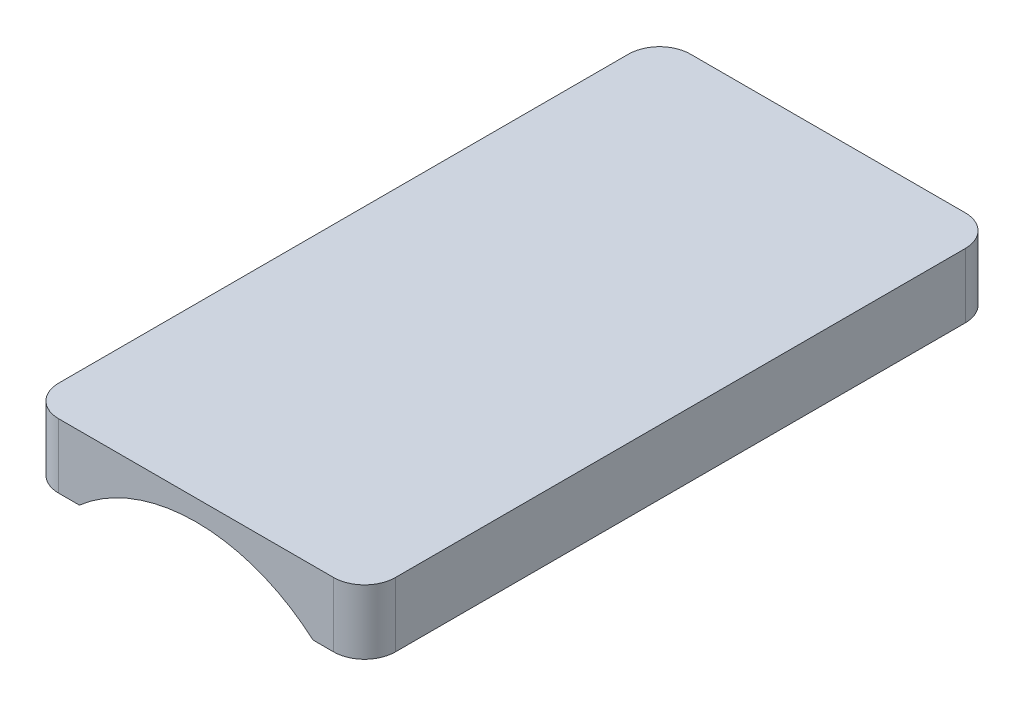
ISO-10303-21;
HEADER;
FILE_DESCRIPTION(('STEP AP214'),'2;1');
FILE_NAME('part.step','',(''),(''),'','','');
FILE_SCHEMA(('AUTOMOTIVE_DESIGN { 1 0 10303 214 1 1 1 1 }'));
ENDSEC;
DATA;
#1=APPLICATION_CONTEXT('core data for automotive mechanical design processes');
#2=APPLICATION_PROTOCOL_DEFINITION('international standard','automotive_design',2000,#1);
#3=PRODUCT_CONTEXT('',#1,'mechanical');
#4=PRODUCT('Part','Part','',(#3));
#5=PRODUCT_RELATED_PRODUCT_CATEGORY('part','',(#4));
#6=PRODUCT_DEFINITION_FORMATION('','',#4);
#7=PRODUCT_DEFINITION_CONTEXT('part definition',#1,'design');
#8=PRODUCT_DEFINITION('design','',#6,#7);
#9=PRODUCT_DEFINITION_SHAPE('','',#8);
#10=(LENGTH_UNIT() NAMED_UNIT(*) SI_UNIT(.MILLI.,.METRE.));
#11=(NAMED_UNIT(*) PLANE_ANGLE_UNIT() SI_UNIT($,.RADIAN.));
#12=(NAMED_UNIT(*) SI_UNIT($,.STERADIAN.) SOLID_ANGLE_UNIT());
#13=UNCERTAINTY_MEASURE_WITH_UNIT(LENGTH_MEASURE(1.E-05),#10,'distance_accuracy_value','');
#14=(GEOMETRIC_REPRESENTATION_CONTEXT(3) GLOBAL_UNCERTAINTY_ASSIGNED_CONTEXT((#13)) GLOBAL_UNIT_ASSIGNED_CONTEXT((#10,
#11,#12)) REPRESENTATION_CONTEXT('',''));
#15=CARTESIAN_POINT('',(0.,0.,0.));
#16=DIRECTION('',(0.,0.,1.));
#17=DIRECTION('',(1.,0.,0.));
#18=AXIS2_PLACEMENT_3D('',#15,#16,#17);
#19=CARTESIAN_POINT('',(32.65,0.,-61.25));
#20=DIRECTION('',(0.,1.,0.));
#21=DIRECTION('',(0.,0.,1.));
#22=AXIS2_PLACEMENT_3D('',#19,#20,#21);
#23=PLANE('',#22);
#24=DIRECTION('',(-1.,0.,0.));
#25=VECTOR('',#24,1.);
#26=CARTESIAN_POINT('',(32.65,0.,0.));
#27=LINE('',#26,#25);
#28=CARTESIAN_POINT('',(5.,0.,0.));
#29=VERTEX_POINT('',#28);
#30=CARTESIAN_POINT('',(3.,0.,0.));
#31=VERTEX_POINT('',#30);
#32=EDGE_CURVE('E211',#29,#31,#27,.T.);
#33=ORIENTED_EDGE('',*,*,#32,.T.);
#34=CARTESIAN_POINT('',(3.,0.,-3.));
#35=DIRECTION('',(0.,1.,0.));
#36=DIRECTION('',(0.,0.,1.));
#37=AXIS2_PLACEMENT_3D('',#34,#35,#36);
#38=CIRCLE('',#37,3.);
#39=CARTESIAN_POINT('',(0.,0.,-3.));
#40=VERTEX_POINT('',#39);
#41=EDGE_CURVE('E241',#31,#40,#38,.F.);
#42=ORIENTED_EDGE('',*,*,#41,.T.);
#43=DIRECTION('',(0.,0.,-1.));
#44=VECTOR('',#43,1.);
#45=CARTESIAN_POINT('',(0.,0.,-61.25));
#46=LINE('',#45,#44);
#47=CARTESIAN_POINT('',(0.,0.,-58.25));
#48=VERTEX_POINT('',#47);
#49=EDGE_CURVE('E203',#40,#48,#46,.T.);
#50=ORIENTED_EDGE('',*,*,#49,.T.);
#51=CARTESIAN_POINT('',(3.,0.,-58.25));
#52=DIRECTION('',(0.,1.,0.));
#53=DIRECTION('',(0.,0.,1.));
#54=AXIS2_PLACEMENT_3D('',#51,#52,#53);
#55=CIRCLE('',#54,3.);
#56=CARTESIAN_POINT('',(3.,0.,-61.25));
#57=VERTEX_POINT('',#56);
#58=EDGE_CURVE('E235',#48,#57,#55,.F.);
#59=ORIENTED_EDGE('',*,*,#58,.T.);
#60=DIRECTION('',(-1.,0.,0.));
#61=VECTOR('',#60,1.);
#62=CARTESIAN_POINT('',(32.65,0.,-61.25));
#63=LINE('',#62,#61);
#64=CARTESIAN_POINT('',(29.65,0.,-61.25));
#65=VERTEX_POINT('',#64);
#66=EDGE_CURVE('E224',#65,#57,#63,.T.);
#67=ORIENTED_EDGE('',*,*,#66,.F.);
#68=CARTESIAN_POINT('',(29.65,0.,-58.25));
#69=DIRECTION('',(0.,1.,0.));
#70=DIRECTION('',(0.,0.,1.));
#71=AXIS2_PLACEMENT_3D('',#68,#69,#70);
#72=CIRCLE('',#71,3.);
#73=CARTESIAN_POINT('',(32.65,0.,-58.25));
#74=VERTEX_POINT('',#73);
#75=EDGE_CURVE('E237',#65,#74,#72,.F.);
#76=ORIENTED_EDGE('',*,*,#75,.T.);
#77=DIRECTION('',(0.,0.,-1.));
#78=VECTOR('',#77,1.);
#79=CARTESIAN_POINT('',(32.65,0.,-61.25));
#80=LINE('',#79,#78);
#81=CARTESIAN_POINT('',(32.65,0.,-3.));
#82=VERTEX_POINT('',#81);
#83=EDGE_CURVE('E204',#82,#74,#80,.T.);
#84=ORIENTED_EDGE('',*,*,#83,.F.);
#85=CARTESIAN_POINT('',(29.65,0.,-3.));
#86=DIRECTION('',(0.,1.,0.));
#87=DIRECTION('',(0.,0.,1.));
#88=AXIS2_PLACEMENT_3D('',#85,#86,#87);
#89=CIRCLE('',#88,3.);
#90=CARTESIAN_POINT('',(29.65,0.,0.));
#91=VERTEX_POINT('',#90);
#92=EDGE_CURVE('E239',#82,#91,#89,.F.);
#93=ORIENTED_EDGE('',*,*,#92,.T.);
#94=CARTESIAN_POINT('',(27.65,0.,0.));
#95=VERTEX_POINT('',#94);
#96=EDGE_CURVE('E218',#91,#95,#27,.T.);
#97=ORIENTED_EDGE('',*,*,#96,.T.);
#98=DIRECTION('',(0.,0.,1.));
#99=VECTOR('',#98,1.);
#100=CARTESIAN_POINT('',(27.65,0.,-35.));
#101=LINE('',#100,#99);
#102=CARTESIAN_POINT('',(27.65,0.,-35.));
#103=VERTEX_POINT('',#102);
#104=EDGE_CURVE('E200',#103,#95,#101,.T.);
#105=ORIENTED_EDGE('',*,*,#104,.F.);
#106=DIRECTION('',(1.,0.,0.));
#107=VECTOR('',#106,1.);
#108=CARTESIAN_POINT('',(5.,0.,-35.));
#109=LINE('',#108,#107);
#110=CARTESIAN_POINT('',(5.,0.,-35.));
#111=VERTEX_POINT('',#110);
#112=EDGE_CURVE('E194',#111,#103,#109,.T.);
#113=ORIENTED_EDGE('',*,*,#112,.F.);
#114=DIRECTION('',(0.,0.,1.));
#115=VECTOR('',#114,1.);
#116=CARTESIAN_POINT('',(5.,0.,-35.));
#117=LINE('',#116,#115);
#118=EDGE_CURVE('E197',#111,#29,#117,.T.);
#119=ORIENTED_EDGE('',*,*,#118,.T.);
#120=EDGE_LOOP('',(#33,#42,#50,#59,#67,#76,#84,#93,#97,#105,#113,#119));
#121=FACE_BOUND('',#120,.T.);
#122=ADVANCED_FACE('F33',(#121),#23,.F.);
#123=CARTESIAN_POINT('',(32.65,6.25,-61.25));
#124=DIRECTION('',(0.,0.,1.));
#125=DIRECTION('',(1.,0.,0.));
#126=AXIS2_PLACEMENT_3D('',#123,#124,#125);
#127=PLANE('',#126);
#128=DIRECTION('',(0.,1.,0.));
#129=VECTOR('',#128,1.);
#130=CARTESIAN_POINT('',(11.175,1.,-61.25));
#131=LINE('',#130,#129);
#132=CARTESIAN_POINT('',(11.175,1.,-61.25));
#133=VERTEX_POINT('',#132);
#134=CARTESIAN_POINT('',(11.175,5.25000000000001,-61.25));
#135=VERTEX_POINT('',#134);
#136=EDGE_CURVE('E177',#133,#135,#131,.T.);
#137=ORIENTED_EDGE('',*,*,#136,.F.);
#138=DIRECTION('',(-1.,0.,0.));
#139=VECTOR('',#138,1.);
#140=CARTESIAN_POINT('',(21.475,1.,-61.25));
#141=LINE('',#140,#139);
#142=CARTESIAN_POINT('',(21.475,1.,-61.25));
#143=VERTEX_POINT('',#142);
#144=EDGE_CURVE('E148',#143,#133,#141,.T.);
#145=ORIENTED_EDGE('',*,*,#144,.F.);
#146=DIRECTION('',(0.707106781186547,-0.707106781186548,0.));
#147=VECTOR('',#146,1.);
#148=CARTESIAN_POINT('',(21.475,1.,-61.25));
#149=LINE('',#148,#147);
#150=CARTESIAN_POINT('',(19.35,3.125,-61.25));
#151=VERTEX_POINT('',#150);
#152=EDGE_CURVE('E166',#151,#143,#149,.T.);
#153=ORIENTED_EDGE('',*,*,#152,.F.);
#154=DIRECTION('',(-0.707106781186547,-0.707106781186548,0.));
#155=VECTOR('',#154,1.);
#156=CARTESIAN_POINT('',(19.35,3.125,-61.25));
#157=LINE('',#156,#155);
#158=CARTESIAN_POINT('',(21.475,5.25000000000001,-61.25));
#159=VERTEX_POINT('',#158);
#160=EDGE_CURVE('E169',#159,#151,#157,.T.);
#161=ORIENTED_EDGE('',*,*,#160,.F.);
#162=DIRECTION('',(1.,0.,0.));
#163=VECTOR('',#162,1.);
#164=CARTESIAN_POINT('',(11.175,5.25000000000001,-61.25));
#165=LINE('',#164,#163);
#166=EDGE_CURVE('E179',#135,#159,#165,.T.);
#167=ORIENTED_EDGE('',*,*,#166,.F.);
#168=EDGE_LOOP('',(#137,#145,#153,#161,#167));
#169=FACE_BOUND('',#168,.T.);
#170=DIRECTION('',(-1.,0.,0.));
#171=VECTOR('',#170,1.);
#172=CARTESIAN_POINT('',(32.65,6.25,-61.25));
#173=LINE('',#172,#171);
#174=CARTESIAN_POINT('',(29.65,6.25,-61.25));
#175=VERTEX_POINT('',#174);
#176=CARTESIAN_POINT('',(3.,6.25,-61.25));
#177=VERTEX_POINT('',#176);
#178=EDGE_CURVE('E222',#175,#177,#173,.T.);
#179=ORIENTED_EDGE('',*,*,#178,.F.);
#180=DIRECTION('',(0.,1.,0.));
#181=VECTOR('',#180,1.);
#182=CARTESIAN_POINT('',(29.65,6.25,-61.25));
#183=LINE('',#182,#181);
#184=EDGE_CURVE('E11',#175,#65,#183,.F.);
#185=ORIENTED_EDGE('',*,*,#184,.T.);
#186=ORIENTED_EDGE('',*,*,#66,.T.);
#187=DIRECTION('',(0.,1.,0.));
#188=VECTOR('',#187,1.);
#189=CARTESIAN_POINT('',(3.,6.25,-61.25));
#190=LINE('',#189,#188);
#191=EDGE_CURVE('E41',#57,#177,#190,.T.);
#192=ORIENTED_EDGE('',*,*,#191,.T.);
#193=EDGE_LOOP('',(#179,#185,#186,#192));
#194=FACE_BOUND('',#193,.T.);
#195=ADVANCED_FACE('F259',(#169,#194),#127,.F.);
#196=CARTESIAN_POINT('',(32.65,6.25,0.));
#197=DIRECTION('',(0.,-1.,0.));
#198=DIRECTION('',(0.,0.,-1.));
#199=AXIS2_PLACEMENT_3D('',#196,#197,#198);
#200=PLANE('',#199);
#201=DIRECTION('',(0.,0.,1.));
#202=VECTOR('',#201,1.);
#203=CARTESIAN_POINT('',(0.,6.25,0.));
#204=LINE('',#203,#202);
#205=CARTESIAN_POINT('',(0.,6.25,-58.25));
#206=VERTEX_POINT('',#205);
#207=CARTESIAN_POINT('',(0.,6.25,-3.));
#208=VERTEX_POINT('',#207);
#209=EDGE_CURVE('E208',#206,#208,#204,.T.);
#210=ORIENTED_EDGE('',*,*,#209,.T.);
#211=CARTESIAN_POINT('',(3.,6.25,-3.));
#212=DIRECTION('',(0.,-1.,0.));
#213=DIRECTION('',(0.,0.,-1.));
#214=AXIS2_PLACEMENT_3D('',#211,#212,#213);
#215=CIRCLE('',#214,3.);
#216=CARTESIAN_POINT('',(3.,6.25,0.));
#217=VERTEX_POINT('',#216);
#218=EDGE_CURVE('E251',#208,#217,#215,.F.);
#219=ORIENTED_EDGE('',*,*,#218,.T.);
#220=DIRECTION('',(-1.,0.,0.));
#221=VECTOR('',#220,1.);
#222=CARTESIAN_POINT('',(32.65,6.25,0.));
#223=LINE('',#222,#221);
#224=CARTESIAN_POINT('',(29.65,6.25,0.));
#225=VERTEX_POINT('',#224);
#226=EDGE_CURVE('E219',#225,#217,#223,.T.);
#227=ORIENTED_EDGE('',*,*,#226,.F.);
#228=CARTESIAN_POINT('',(29.65,6.25,-3.));
#229=DIRECTION('',(0.,-1.,0.));
#230=DIRECTION('',(0.,0.,-1.));
#231=AXIS2_PLACEMENT_3D('',#228,#229,#230);
#232=CIRCLE('',#231,3.);
#233=CARTESIAN_POINT('',(32.65,6.25,-3.));
#234=VERTEX_POINT('',#233);
#235=EDGE_CURVE('E249',#225,#234,#232,.F.);
#236=ORIENTED_EDGE('',*,*,#235,.T.);
#237=DIRECTION('',(0.,0.,1.));
#238=VECTOR('',#237,1.);
#239=CARTESIAN_POINT('',(32.65,6.25,0.));
#240=LINE('',#239,#238);
#241=CARTESIAN_POINT('',(32.65,6.25,-58.25));
#242=VERTEX_POINT('',#241);
#243=EDGE_CURVE('E207',#242,#234,#240,.T.);
#244=ORIENTED_EDGE('',*,*,#243,.F.);
#245=CARTESIAN_POINT('',(29.65,6.25,-58.25));
#246=DIRECTION('',(0.,-1.,0.));
#247=DIRECTION('',(0.,0.,-1.));
#248=AXIS2_PLACEMENT_3D('',#245,#246,#247);
#249=CIRCLE('',#248,3.);
#250=EDGE_CURVE('E56',#242,#175,#249,.F.);
#251=ORIENTED_EDGE('',*,*,#250,.T.);
#252=ORIENTED_EDGE('',*,*,#178,.T.);
#253=CARTESIAN_POINT('',(3.,6.25,-58.25));
#254=DIRECTION('',(0.,-1.,0.));
#255=DIRECTION('',(0.,0.,-1.));
#256=AXIS2_PLACEMENT_3D('',#253,#254,#255);
#257=CIRCLE('',#256,3.);
#258=EDGE_CURVE('E48',#177,#206,#257,.F.);
#259=ORIENTED_EDGE('',*,*,#258,.T.);
#260=EDGE_LOOP('',(#210,#219,#227,#236,#244,#251,#252,#259));
#261=FACE_BOUND('',#260,.T.);
#262=ADVANCED_FACE('F263',(#261),#200,.F.);
#263=CARTESIAN_POINT('',(32.65,0.,0.));
#264=DIRECTION('',(0.,0.,-1.));
#265=DIRECTION('',(-1.,0.,0.));
#266=AXIS2_PLACEMENT_3D('',#263,#264,#265);
#267=PLANE('',#266);
#268=ORIENTED_EDGE('',*,*,#226,.T.);
#269=DIRECTION('',(0.,-1.,0.));
#270=VECTOR('',#269,1.);
#271=CARTESIAN_POINT('',(3.,0.,0.));
#272=LINE('',#271,#270);
#273=EDGE_CURVE('E232',#217,#31,#272,.T.);
#274=ORIENTED_EDGE('',*,*,#273,.T.);
#275=ORIENTED_EDGE('',*,*,#32,.F.);
#276=CARTESIAN_POINT('',(16.325,-12.9638970588235,0.));
#277=DIRECTION('',(0.,0.,1.));
#278=DIRECTION('',(1.,0.,0.));
#279=AXIS2_PLACEMENT_3D('',#276,#277,#278);
#280=CIRCLE('',#279,17.2138970588235);
#281=EDGE_CURVE('E227',#29,#95,#280,.F.);
#282=ORIENTED_EDGE('',*,*,#281,.T.);
#283=ORIENTED_EDGE('',*,*,#96,.F.);
#284=DIRECTION('',(0.,-1.,0.));
#285=VECTOR('',#284,1.);
#286=CARTESIAN_POINT('',(29.65,0.,0.));
#287=LINE('',#286,#285);
#288=EDGE_CURVE('E230',#91,#225,#287,.F.);
#289=ORIENTED_EDGE('',*,*,#288,.T.);
#290=EDGE_LOOP('',(#268,#274,#275,#282,#283,#289));
#291=FACE_BOUND('',#290,.T.);
#292=ADVANCED_FACE('F278',(#291),#267,.F.);
#293=CARTESIAN_POINT('',(32.65,0.,0.));
#294=DIRECTION('',(-1.,0.,0.));
#295=DIRECTION('',(0.,0.,1.));
#296=AXIS2_PLACEMENT_3D('',#293,#294,#295);
#297=PLANE('',#296);
#298=ORIENTED_EDGE('',*,*,#243,.T.);
#299=DIRECTION('',(0.,-1.,0.));
#300=VECTOR('',#299,1.);
#301=CARTESIAN_POINT('',(32.65,0.,-3.));
#302=LINE('',#301,#300);
#303=EDGE_CURVE('E256',#234,#82,#302,.T.);
#304=ORIENTED_EDGE('',*,*,#303,.T.);
#305=ORIENTED_EDGE('',*,*,#83,.T.);
#306=DIRECTION('',(0.,1.,0.));
#307=VECTOR('',#306,1.);
#308=CARTESIAN_POINT('',(32.65,0.,-58.25));
#309=LINE('',#308,#307);
#310=EDGE_CURVE('E253',#74,#242,#309,.T.);
#311=ORIENTED_EDGE('',*,*,#310,.T.);
#312=EDGE_LOOP('',(#298,#304,#305,#311));
#313=FACE_BOUND('',#312,.T.);
#314=ADVANCED_FACE('F286',(#313),#297,.F.);
#315=CARTESIAN_POINT('',(0.,0.,0.));
#316=DIRECTION('',(-1.,0.,0.));
#317=DIRECTION('',(0.,0.,1.));
#318=AXIS2_PLACEMENT_3D('',#315,#316,#317);
#319=PLANE('',#318);
#320=ORIENTED_EDGE('',*,*,#49,.F.);
#321=DIRECTION('',(0.,-1.,0.));
#322=VECTOR('',#321,1.);
#323=CARTESIAN_POINT('',(0.,6.25,-3.));
#324=LINE('',#323,#322);
#325=EDGE_CURVE('E245',#40,#208,#324,.F.);
#326=ORIENTED_EDGE('',*,*,#325,.T.);
#327=ORIENTED_EDGE('',*,*,#209,.F.);
#328=DIRECTION('',(0.,1.,0.));
#329=VECTOR('',#328,1.);
#330=CARTESIAN_POINT('',(0.,0.,-58.25));
#331=LINE('',#330,#329);
#332=EDGE_CURVE('E243',#206,#48,#331,.F.);
#333=ORIENTED_EDGE('',*,*,#332,.T.);
#334=EDGE_LOOP('',(#320,#326,#327,#333));
#335=FACE_BOUND('',#334,.T.);
#336=ADVANCED_FACE('F268',(#335),#319,.T.);
#337=CARTESIAN_POINT('',(16.325,-12.9638970588235,-35.));
#338=DIRECTION('',(0.,0.,1.));
#339=DIRECTION('',(1.,0.,0.));
#340=AXIS2_PLACEMENT_3D('',#337,#338,#339);
#341=CYLINDRICAL_SURFACE('',#340,17.2138970588235);
#342=ORIENTED_EDGE('',*,*,#118,.F.);
#343=CARTESIAN_POINT('',(16.325,-12.9638970588235,-35.));
#344=DIRECTION('',(0.,0.,1.));
#345=DIRECTION('',(-1.,0.,0.));
#346=AXIS2_PLACEMENT_3D('',#343,#344,#345);
#347=CIRCLE('',#346,17.2138970588235);
#348=EDGE_CURVE('E186',#103,#111,#347,.T.);
#349=ORIENTED_EDGE('',*,*,#348,.F.);
#350=ORIENTED_EDGE('',*,*,#104,.T.);
#351=ORIENTED_EDGE('',*,*,#281,.F.);
#352=EDGE_LOOP('',(#342,#349,#350,#351));
#353=FACE_BOUND('',#352,.T.);
#354=ADVANCED_FACE('F294',(#353),#341,.F.);
#355=CARTESIAN_POINT('',(16.325,-12.9638970588235,-35.));
#356=DIRECTION('',(0.,0.,-1.));
#357=DIRECTION('',(-1.,0.,0.));
#358=AXIS2_PLACEMENT_3D('',#355,#356,#357);
#359=PLANE('',#358);
#360=ORIENTED_EDGE('',*,*,#348,.T.);
#361=ORIENTED_EDGE('',*,*,#112,.T.);
#362=EDGE_LOOP('',(#360,#361));
#363=FACE_BOUND('',#362,.T.);
#364=ADVANCED_FACE('F296',(#363),#359,.F.);
#365=CARTESIAN_POINT('',(21.475,1.,-51.25));
#366=DIRECTION('',(0.,-1.,0.));
#367=DIRECTION('',(1.,0.,0.));
#368=AXIS2_PLACEMENT_3D('',#365,#366,#367);
#369=PLANE('',#368);
#370=ORIENTED_EDGE('',*,*,#144,.T.);
#371=DIRECTION('',(0.,0.,-1.));
#372=VECTOR('',#371,1.);
#373=CARTESIAN_POINT('',(11.175,1.,-51.25));
#374=LINE('',#373,#372);
#375=CARTESIAN_POINT('',(11.175,1.,-51.25));
#376=VERTEX_POINT('',#375);
#377=EDGE_CURVE('E141',#376,#133,#374,.T.);
#378=ORIENTED_EDGE('',*,*,#377,.F.);
#379=DIRECTION('',(-1.,0.,0.));
#380=VECTOR('',#379,1.);
#381=CARTESIAN_POINT('',(21.475,1.,-51.25));
#382=LINE('',#381,#380);
#383=CARTESIAN_POINT('',(21.475,1.,-51.25));
#384=VERTEX_POINT('',#383);
#385=EDGE_CURVE('E145',#384,#376,#382,.T.);
#386=ORIENTED_EDGE('',*,*,#385,.F.);
#387=DIRECTION('',(0.,0.,-1.));
#388=VECTOR('',#387,1.);
#389=CARTESIAN_POINT('',(21.475,1.,-51.25));
#390=LINE('',#389,#388);
#391=EDGE_CURVE('E184',#384,#143,#390,.T.);
#392=ORIENTED_EDGE('',*,*,#391,.T.);
#393=EDGE_LOOP('',(#370,#378,#386,#392));
#394=FACE_BOUND('',#393,.T.);
#395=ADVANCED_FACE('F143',(#394),#369,.F.);
#396=CARTESIAN_POINT('',(21.475,1.,-51.25));
#397=DIRECTION('',(0.707106781186548,0.707106781186547,0.));
#398=DIRECTION('',(-0.707106781186547,0.707106781186548,0.));
#399=AXIS2_PLACEMENT_3D('',#396,#397,#398);
#400=PLANE('',#399);
#401=ORIENTED_EDGE('',*,*,#152,.T.);
#402=ORIENTED_EDGE('',*,*,#391,.F.);
#403=DIRECTION('',(0.707106781186547,-0.707106781186548,0.));
#404=VECTOR('',#403,1.);
#405=CARTESIAN_POINT('',(21.475,1.,-51.25));
#406=LINE('',#405,#404);
#407=CARTESIAN_POINT('',(19.35,3.125,-51.25));
#408=VERTEX_POINT('',#407);
#409=EDGE_CURVE('E153',#408,#384,#406,.T.);
#410=ORIENTED_EDGE('',*,*,#409,.F.);
#411=DIRECTION('',(0.,0.,-1.));
#412=VECTOR('',#411,1.);
#413=CARTESIAN_POINT('',(19.35,3.125,-51.25));
#414=LINE('',#413,#412);
#415=EDGE_CURVE('E187',#408,#151,#414,.T.);
#416=ORIENTED_EDGE('',*,*,#415,.T.);
#417=EDGE_LOOP('',(#401,#402,#410,#416));
#418=FACE_BOUND('',#417,.T.);
#419=ADVANCED_FACE('F303',(#418),#400,.F.);
#420=CARTESIAN_POINT('',(19.35,3.125,-51.25));
#421=DIRECTION('',(0.707106781186548,-0.707106781186547,0.));
#422=DIRECTION('',(0.707106781186547,0.707106781186548,0.));
#423=AXIS2_PLACEMENT_3D('',#420,#421,#422);
#424=PLANE('',#423);
#425=ORIENTED_EDGE('',*,*,#160,.T.);
#426=ORIENTED_EDGE('',*,*,#415,.F.);
#427=DIRECTION('',(-0.707106781186547,-0.707106781186548,0.));
#428=VECTOR('',#427,1.);
#429=CARTESIAN_POINT('',(19.35,3.125,-51.25));
#430=LINE('',#429,#428);
#431=CARTESIAN_POINT('',(21.475,5.25000000000001,-51.25));
#432=VERTEX_POINT('',#431);
#433=EDGE_CURVE('E173',#432,#408,#430,.T.);
#434=ORIENTED_EDGE('',*,*,#433,.F.);
#435=DIRECTION('',(0.,0.,-1.));
#436=VECTOR('',#435,1.);
#437=CARTESIAN_POINT('',(21.475,5.25000000000001,-51.25));
#438=LINE('',#437,#436);
#439=EDGE_CURVE('E189',#432,#159,#438,.T.);
#440=ORIENTED_EDGE('',*,*,#439,.T.);
#441=EDGE_LOOP('',(#425,#426,#434,#440));
#442=FACE_BOUND('',#441,.T.);
#443=ADVANCED_FACE('F408',(#442),#424,.F.);
#444=CARTESIAN_POINT('',(11.175,5.25000000000001,-51.25));
#445=DIRECTION('',(0.,1.,0.));
#446=DIRECTION('',(0.,0.,1.));
#447=AXIS2_PLACEMENT_3D('',#444,#445,#446);
#448=PLANE('',#447);
#449=ORIENTED_EDGE('',*,*,#166,.T.);
#450=ORIENTED_EDGE('',*,*,#439,.F.);
#451=DIRECTION('',(1.,0.,0.));
#452=VECTOR('',#451,1.);
#453=CARTESIAN_POINT('',(11.175,5.25000000000001,-51.25));
#454=LINE('',#453,#452);
#455=CARTESIAN_POINT('',(11.175,5.25000000000001,-51.25));
#456=VERTEX_POINT('',#455);
#457=EDGE_CURVE('E161',#456,#432,#454,.T.);
#458=ORIENTED_EDGE('',*,*,#457,.F.);
#459=DIRECTION('',(0.,0.,-1.));
#460=VECTOR('',#459,1.);
#461=CARTESIAN_POINT('',(11.175,5.25000000000001,-51.25));
#462=LINE('',#461,#460);
#463=EDGE_CURVE('E152',#456,#135,#462,.T.);
#464=ORIENTED_EDGE('',*,*,#463,.T.);
#465=EDGE_LOOP('',(#449,#450,#458,#464));
#466=FACE_BOUND('',#465,.T.);
#467=ADVANCED_FACE('F399',(#466),#448,.F.);
#468=CARTESIAN_POINT('',(11.175,1.,-51.25));
#469=DIRECTION('',(-1.,0.,0.));
#470=DIRECTION('',(0.,0.,1.));
#471=AXIS2_PLACEMENT_3D('',#468,#469,#470);
#472=PLANE('',#471);
#473=ORIENTED_EDGE('',*,*,#136,.T.);
#474=ORIENTED_EDGE('',*,*,#463,.F.);
#475=DIRECTION('',(0.,1.,0.));
#476=VECTOR('',#475,1.);
#477=CARTESIAN_POINT('',(11.175,1.,-51.25));
#478=LINE('',#477,#476);
#479=EDGE_CURVE('E156',#376,#456,#478,.T.);
#480=ORIENTED_EDGE('',*,*,#479,.F.);
#481=ORIENTED_EDGE('',*,*,#377,.T.);
#482=EDGE_LOOP('',(#473,#474,#480,#481));
#483=FACE_BOUND('',#482,.T.);
#484=ADVANCED_FACE('F157',(#483),#472,.F.);
#485=CARTESIAN_POINT('',(0.,0.,-51.25));
#486=DIRECTION('',(0.,0.,-1.));
#487=DIRECTION('',(-1.,0.,0.));
#488=AXIS2_PLACEMENT_3D('',#485,#486,#487);
#489=PLANE('',#488);
#490=ORIENTED_EDGE('',*,*,#385,.T.);
#491=ORIENTED_EDGE('',*,*,#479,.T.);
#492=ORIENTED_EDGE('',*,*,#457,.T.);
#493=ORIENTED_EDGE('',*,*,#433,.T.);
#494=ORIENTED_EDGE('',*,*,#409,.T.);
#495=EDGE_LOOP('',(#490,#491,#492,#493,#494));
#496=FACE_BOUND('',#495,.T.);
#497=ADVANCED_FACE('F163',(#496),#489,.T.);
#498=CARTESIAN_POINT('',(3.,0.,-3.));
#499=DIRECTION('',(0.,1.,0.));
#500=DIRECTION('',(0.,0.,1.));
#501=AXIS2_PLACEMENT_3D('',#498,#499,#500);
#502=CYLINDRICAL_SURFACE('',#501,3.);
#503=ORIENTED_EDGE('',*,*,#218,.F.);
#504=ORIENTED_EDGE('',*,*,#325,.F.);
#505=ORIENTED_EDGE('',*,*,#41,.F.);
#506=ORIENTED_EDGE('',*,*,#273,.F.);
#507=EDGE_LOOP('',(#503,#504,#505,#506));
#508=FACE_BOUND('',#507,.T.);
#509=ADVANCED_FACE('F273',(#508),#502,.T.);
#510=CARTESIAN_POINT('',(29.65,0.,-3.));
#511=DIRECTION('',(0.,-1.,0.));
#512=DIRECTION('',(0.,0.,-1.));
#513=AXIS2_PLACEMENT_3D('',#510,#511,#512);
#514=CYLINDRICAL_SURFACE('',#513,3.);
#515=ORIENTED_EDGE('',*,*,#235,.F.);
#516=ORIENTED_EDGE('',*,*,#288,.F.);
#517=ORIENTED_EDGE('',*,*,#92,.F.);
#518=ORIENTED_EDGE('',*,*,#303,.F.);
#519=EDGE_LOOP('',(#515,#516,#517,#518));
#520=FACE_BOUND('',#519,.T.);
#521=ADVANCED_FACE('F283',(#520),#514,.T.);
#522=CARTESIAN_POINT('',(29.65,0.,-58.25));
#523=DIRECTION('',(0.,1.,0.));
#524=DIRECTION('',(0.,0.,1.));
#525=AXIS2_PLACEMENT_3D('',#522,#523,#524);
#526=CYLINDRICAL_SURFACE('',#525,3.);
#527=ORIENTED_EDGE('',*,*,#75,.F.);
#528=ORIENTED_EDGE('',*,*,#184,.F.);
#529=ORIENTED_EDGE('',*,*,#250,.F.);
#530=ORIENTED_EDGE('',*,*,#310,.F.);
#531=EDGE_LOOP('',(#527,#528,#529,#530));
#532=FACE_BOUND('',#531,.T.);
#533=ADVANCED_FACE('F290',(#532),#526,.T.);
#534=CARTESIAN_POINT('',(3.,6.25,-58.25));
#535=DIRECTION('',(0.,-1.,0.));
#536=DIRECTION('',(0.,0.,-1.));
#537=AXIS2_PLACEMENT_3D('',#534,#535,#536);
#538=CYLINDRICAL_SURFACE('',#537,3.);
#539=ORIENTED_EDGE('',*,*,#58,.F.);
#540=ORIENTED_EDGE('',*,*,#332,.F.);
#541=ORIENTED_EDGE('',*,*,#258,.F.);
#542=ORIENTED_EDGE('',*,*,#191,.F.);
#543=EDGE_LOOP('',(#539,#540,#541,#542));
#544=FACE_BOUND('',#543,.T.);
#545=ADVANCED_FACE('F35',(#544),#538,.T.);
#546=CLOSED_SHELL('',(#122,#195,#262,#292,#314,#336,#354,#364,#395,#419,#443,#467,#484,#497,
#509,#521,#533,#545));
#547=MANIFOLD_SOLID_BREP('B2',#546);
#548=ADVANCED_BREP_SHAPE_REPRESENTATION('',(#18,#547),#14);
#549=SHAPE_DEFINITION_REPRESENTATION(#9,#548);
ENDSEC;
END-ISO-10303-21;
